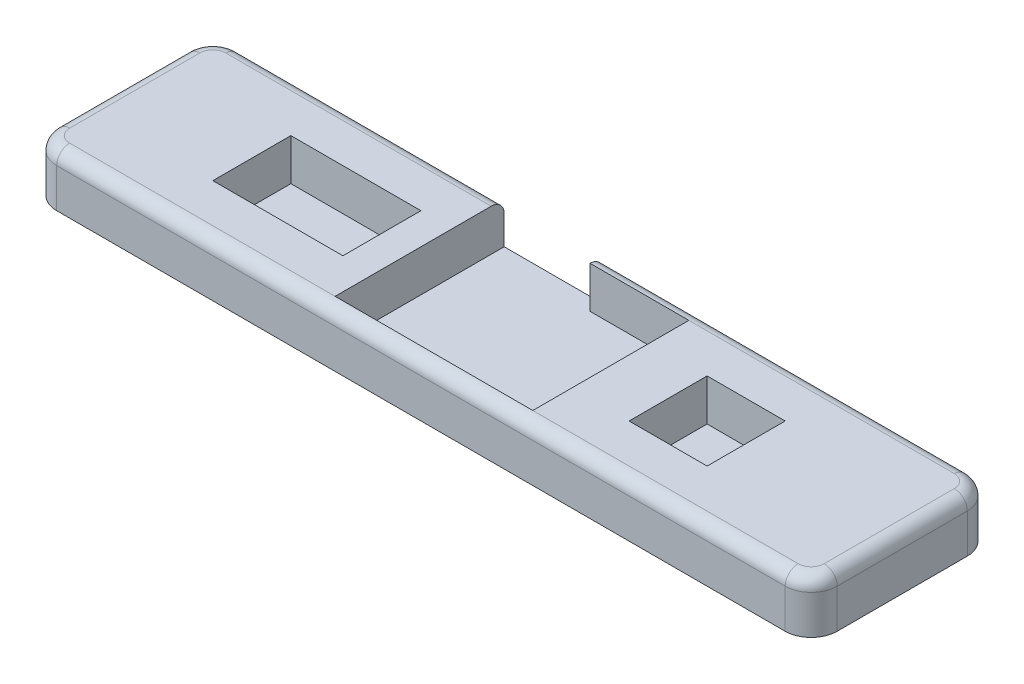
ISO-10303-21;
HEADER;
FILE_DESCRIPTION(('STEP AP214'),'2;1');
FILE_NAME('part.step','',(''),(''),'','','');
FILE_SCHEMA(('AUTOMOTIVE_DESIGN { 1 0 10303 214 1 1 1 1 }'));
ENDSEC;
DATA;
#1=APPLICATION_CONTEXT('core data for automotive mechanical design processes');
#2=APPLICATION_PROTOCOL_DEFINITION('international standard','automotive_design',2000,#1);
#3=PRODUCT_CONTEXT('',#1,'mechanical');
#4=PRODUCT('Part','Part','',(#3));
#5=PRODUCT_RELATED_PRODUCT_CATEGORY('part','',(#4));
#6=PRODUCT_DEFINITION_FORMATION('','',#4);
#7=PRODUCT_DEFINITION_CONTEXT('part definition',#1,'design');
#8=PRODUCT_DEFINITION('design','',#6,#7);
#9=PRODUCT_DEFINITION_SHAPE('','',#8);
#10=(LENGTH_UNIT() NAMED_UNIT(*) SI_UNIT(.MILLI.,.METRE.));
#11=(NAMED_UNIT(*) PLANE_ANGLE_UNIT() SI_UNIT($,.RADIAN.));
#12=(NAMED_UNIT(*) SI_UNIT($,.STERADIAN.) SOLID_ANGLE_UNIT());
#13=UNCERTAINTY_MEASURE_WITH_UNIT(LENGTH_MEASURE(1.E-05),#10,'distance_accuracy_value','');
#14=(GEOMETRIC_REPRESENTATION_CONTEXT(3) GLOBAL_UNCERTAINTY_ASSIGNED_CONTEXT((#13)) GLOBAL_UNIT_ASSIGNED_CONTEXT((#10,
#11,#12)) REPRESENTATION_CONTEXT('',''));
#15=CARTESIAN_POINT('',(0.,0.,0.));
#16=DIRECTION('',(0.,0.,1.));
#17=DIRECTION('',(1.,0.,0.));
#18=AXIS2_PLACEMENT_3D('',#15,#16,#17);
#19=CARTESIAN_POINT('',(0.,10.,0.));
#20=DIRECTION('',(0.,-1.,0.));
#21=DIRECTION('',(0.,0.,-1.));
#22=AXIS2_PLACEMENT_3D('',#19,#20,#21);
#23=PLANE('',#22);
#24=DIRECTION('',(0.,0.,-1.));
#25=VECTOR('',#24,1.);
#26=CARTESIAN_POINT('',(45.,10.,7.5));
#27=LINE('',#26,#25);
#28=CARTESIAN_POINT('',(45.,10.,7.5));
#29=VERTEX_POINT('',#28);
#30=CARTESIAN_POINT('',(45.,10.,-7.5));
#31=VERTEX_POINT('',#30);
#32=EDGE_CURVE('E457',#29,#31,#27,.T.);
#33=ORIENTED_EDGE('',*,*,#32,.F.);
#34=DIRECTION('',(1.,0.,0.));
#35=VECTOR('',#34,1.);
#36=CARTESIAN_POINT('',(30.,10.,7.5));
#37=LINE('',#36,#35);
#38=CARTESIAN_POINT('',(30.,10.,7.5));
#39=VERTEX_POINT('',#38);
#40=EDGE_CURVE('E450',#39,#29,#37,.T.);
#41=ORIENTED_EDGE('',*,*,#40,.F.);
#42=DIRECTION('',(0.,0.,1.));
#43=VECTOR('',#42,1.);
#44=CARTESIAN_POINT('',(30.,10.,7.5));
#45=LINE('',#44,#43);
#46=CARTESIAN_POINT('',(30.,10.,-7.5));
#47=VERTEX_POINT('',#46);
#48=EDGE_CURVE('E452',#47,#39,#45,.T.);
#49=ORIENTED_EDGE('',*,*,#48,.F.);
#50=DIRECTION('',(-1.,0.,0.));
#51=VECTOR('',#50,1.);
#52=CARTESIAN_POINT('',(30.,10.,-7.5));
#53=LINE('',#52,#51);
#54=EDGE_CURVE('E455',#31,#47,#53,.T.);
#55=ORIENTED_EDGE('',*,*,#54,.F.);
#56=EDGE_LOOP('',(#33,#41,#49,#55));
#57=FACE_BOUND('',#56,.T.);
#58=CARTESIAN_POINT('',(70.,10.,12.5));
#59=DIRECTION('',(0.,-1.,0.));
#60=DIRECTION('',(0.,0.,-1.));
#61=AXIS2_PLACEMENT_3D('',#58,#59,#60);
#62=CIRCLE('',#61,2.5);
#63=CARTESIAN_POINT('',(72.5,10.,12.5));
#64=VERTEX_POINT('',#63);
#65=CARTESIAN_POINT('',(70.,10.,15.));
#66=VERTEX_POINT('',#65);
#67=EDGE_CURVE('E269',#64,#66,#62,.T.);
#68=ORIENTED_EDGE('',*,*,#67,.F.);
#69=DIRECTION('',(0.,0.,-1.));
#70=VECTOR('',#69,1.);
#71=CARTESIAN_POINT('',(72.5,10.,0.));
#72=LINE('',#71,#70);
#73=CARTESIAN_POINT('',(72.5,10.,-12.5));
#74=VERTEX_POINT('',#73);
#75=EDGE_CURVE('E342',#64,#74,#72,.T.);
#76=ORIENTED_EDGE('',*,*,#75,.T.);
#77=CARTESIAN_POINT('',(70.,10.,-12.5));
#78=DIRECTION('',(0.,-1.,0.));
#79=DIRECTION('',(0.,0.,-1.));
#80=AXIS2_PLACEMENT_3D('',#77,#78,#79);
#81=CIRCLE('',#80,2.5);
#82=CARTESIAN_POINT('',(70.,10.,-15.));
#83=VERTEX_POINT('',#82);
#84=EDGE_CURVE('E266',#83,#74,#81,.T.);
#85=ORIENTED_EDGE('',*,*,#84,.F.);
#86=DIRECTION('',(-1.,0.,0.));
#87=VECTOR('',#86,1.);
#88=CARTESIAN_POINT('',(0.,10.,-15.));
#89=LINE('',#88,#87);
#90=CARTESIAN_POINT('',(19.,10.,-15.));
#91=VERTEX_POINT('',#90);
#92=EDGE_CURVE('E345',#83,#91,#89,.T.);
#93=ORIENTED_EDGE('',*,*,#92,.T.);
#94=DIRECTION('',(0.,0.,-1.));
#95=VECTOR('',#94,1.);
#96=CARTESIAN_POINT('',(19.,10.,15.));
#97=LINE('',#96,#95);
#98=CARTESIAN_POINT('',(19.,10.,15.));
#99=VERTEX_POINT('',#98);
#100=EDGE_CURVE('E238',#99,#91,#97,.T.);
#101=ORIENTED_EDGE('',*,*,#100,.F.);
#102=DIRECTION('',(1.,0.,0.));
#103=VECTOR('',#102,1.);
#104=CARTESIAN_POINT('',(0.,10.,15.));
#105=LINE('',#104,#103);
#106=EDGE_CURVE('E347',#99,#66,#105,.T.);
#107=ORIENTED_EDGE('',*,*,#106,.T.);
#108=EDGE_LOOP('',(#68,#76,#85,#93,#101,#107));
#109=FACE_BOUND('',#108,.T.);
#110=ADVANCED_FACE('F39',(#57,#109),#23,.F.);
#111=DIRECTION('',(0.,0.,-1.));
#112=VECTOR('',#111,1.);
#113=CARTESIAN_POINT('',(-25.,10.,7.5));
#114=LINE('',#113,#112);
#115=CARTESIAN_POINT('',(-25.,10.,7.5));
#116=VERTEX_POINT('',#115);
#117=CARTESIAN_POINT('',(-25.,10.,-7.5));
#118=VERTEX_POINT('',#117);
#119=EDGE_CURVE('E436',#116,#118,#114,.T.);
#120=ORIENTED_EDGE('',*,*,#119,.F.);
#121=DIRECTION('',(1.,0.,0.));
#122=VECTOR('',#121,1.);
#123=CARTESIAN_POINT('',(-50.,10.,7.5));
#124=LINE('',#123,#122);
#125=CARTESIAN_POINT('',(-50.,10.,7.5));
#126=VERTEX_POINT('',#125);
#127=EDGE_CURVE('E429',#126,#116,#124,.T.);
#128=ORIENTED_EDGE('',*,*,#127,.F.);
#129=DIRECTION('',(0.,0.,1.));
#130=VECTOR('',#129,1.);
#131=CARTESIAN_POINT('',(-50.,10.,7.5));
#132=LINE('',#131,#130);
#133=CARTESIAN_POINT('',(-50.,10.,-7.5));
#134=VERTEX_POINT('',#133);
#135=EDGE_CURVE('E431',#134,#126,#132,.T.);
#136=ORIENTED_EDGE('',*,*,#135,.F.);
#137=DIRECTION('',(-1.,0.,0.));
#138=VECTOR('',#137,1.);
#139=CARTESIAN_POINT('',(-50.,10.,-7.5));
#140=LINE('',#139,#138);
#141=EDGE_CURVE('E434',#118,#134,#140,.T.);
#142=ORIENTED_EDGE('',*,*,#141,.F.);
#143=EDGE_LOOP('',(#120,#128,#136,#142));
#144=FACE_BOUND('',#143,.T.);
#145=CARTESIAN_POINT('',(-70.,10.,12.5));
#146=DIRECTION('',(0.,-1.,0.));
#147=DIRECTION('',(0.,0.,-1.));
#148=AXIS2_PLACEMENT_3D('',#145,#146,#147);
#149=CIRCLE('',#148,2.5);
#150=CARTESIAN_POINT('',(-70.,10.,15.));
#151=VERTEX_POINT('',#150);
#152=CARTESIAN_POINT('',(-72.5,10.,12.5));
#153=VERTEX_POINT('',#152);
#154=EDGE_CURVE('E256',#151,#153,#149,.T.);
#155=ORIENTED_EDGE('',*,*,#154,.F.);
#156=DIRECTION('',(1.,0.,0.));
#157=VECTOR('',#156,1.);
#158=CARTESIAN_POINT('',(0.,10.,15.));
#159=LINE('',#158,#157);
#160=CARTESIAN_POINT('',(-19.,10.,15.));
#161=VERTEX_POINT('',#160);
#162=EDGE_CURVE('E350',#151,#161,#159,.T.);
#163=ORIENTED_EDGE('',*,*,#162,.T.);
#164=DIRECTION('',(0.,0.,1.));
#165=VECTOR('',#164,1.);
#166=CARTESIAN_POINT('',(-19.,10.,15.));
#167=LINE('',#166,#165);
#168=CARTESIAN_POINT('',(-19.,10.,-15.));
#169=VERTEX_POINT('',#168);
#170=EDGE_CURVE('E237',#169,#161,#167,.T.);
#171=ORIENTED_EDGE('',*,*,#170,.F.);
#172=DIRECTION('',(-1.,0.,0.));
#173=VECTOR('',#172,1.);
#174=CARTESIAN_POINT('',(0.,10.,-15.));
#175=LINE('',#174,#173);
#176=CARTESIAN_POINT('',(-70.,10.,-15.));
#177=VERTEX_POINT('',#176);
#178=EDGE_CURVE('E355',#169,#177,#175,.T.);
#179=ORIENTED_EDGE('',*,*,#178,.T.);
#180=CARTESIAN_POINT('',(-70.,10.,-12.5));
#181=DIRECTION('',(0.,-1.,0.));
#182=DIRECTION('',(0.,0.,-1.));
#183=AXIS2_PLACEMENT_3D('',#180,#181,#182);
#184=CIRCLE('',#183,2.5);
#185=CARTESIAN_POINT('',(-72.5,10.,-12.5));
#186=VERTEX_POINT('',#185);
#187=EDGE_CURVE('E248',#186,#177,#184,.T.);
#188=ORIENTED_EDGE('',*,*,#187,.F.);
#189=DIRECTION('',(0.,0.,1.));
#190=VECTOR('',#189,1.);
#191=CARTESIAN_POINT('',(-72.5,10.,0.));
#192=LINE('',#191,#190);
#193=EDGE_CURVE('E352',#186,#153,#192,.T.);
#194=ORIENTED_EDGE('',*,*,#193,.T.);
#195=EDGE_LOOP('',(#155,#163,#171,#179,#188,#194));
#196=FACE_BOUND('',#195,.T.);
#197=ADVANCED_FACE('F376',(#144,#196),#23,.F.);
#198=CARTESIAN_POINT('',(-19.,10.,-15.));
#199=DIRECTION('',(0.,0.,1.));
#200=DIRECTION('',(1.,0.,0.));
#201=AXIS2_PLACEMENT_3D('',#198,#199,#200);
#202=PLANE('',#201);
#203=DIRECTION('',(-1.,0.,0.));
#204=VECTOR('',#203,1.);
#205=CARTESIAN_POINT('',(-19.,10.,-15.));
#206=LINE('',#205,#204);
#207=CARTESIAN_POINT('',(0.,10.,-15.));
#208=VERTEX_POINT('',#207);
#209=EDGE_CURVE('E231',#91,#208,#206,.T.);
#210=ORIENTED_EDGE('',*,*,#209,.T.);
#211=DIRECTION('',(0.,-1.,0.));
#212=VECTOR('',#211,1.);
#213=CARTESIAN_POINT('',(0.,10.,-15.));
#214=LINE('',#213,#212);
#215=CARTESIAN_POINT('',(0.,2.,-15.));
#216=VERTEX_POINT('',#215);
#217=EDGE_CURVE('E216',#208,#216,#214,.T.);
#218=ORIENTED_EDGE('',*,*,#217,.T.);
#219=DIRECTION('',(1.,0.,0.));
#220=VECTOR('',#219,1.);
#221=CARTESIAN_POINT('',(-19.,2.,-15.));
#222=LINE('',#221,#220);
#223=CARTESIAN_POINT('',(19.,2.,-15.));
#224=VERTEX_POINT('',#223);
#225=EDGE_CURVE('E473',#216,#224,#222,.T.);
#226=ORIENTED_EDGE('',*,*,#225,.T.);
#227=DIRECTION('',(0.,-1.,0.));
#228=VECTOR('',#227,1.);
#229=CARTESIAN_POINT('',(19.,10.,-15.));
#230=LINE('',#229,#228);
#231=EDGE_CURVE('E234',#91,#224,#230,.T.);
#232=ORIENTED_EDGE('',*,*,#231,.F.);
#233=EDGE_LOOP('',(#210,#218,#226,#232));
#234=FACE_BOUND('',#233,.T.);
#235=ADVANCED_FACE('F232',(#234),#202,.T.);
#236=CARTESIAN_POINT('',(-75.,10.,-17.5));
#237=DIRECTION('',(0.,0.,1.));
#238=DIRECTION('',(1.,0.,0.));
#239=AXIS2_PLACEMENT_3D('',#236,#237,#238);
#240=PLANE('',#239);
#241=DIRECTION('',(-1.,0.,0.));
#242=VECTOR('',#241,1.);
#243=CARTESIAN_POINT('',(-75.,7.5,-17.5));
#244=LINE('',#243,#242);
#245=CARTESIAN_POINT('',(0.,7.5,-17.5));
#246=VERTEX_POINT('',#245);
#247=CARTESIAN_POINT('',(70.,7.5,-17.5));
#248=VERTEX_POINT('',#247);
#249=EDGE_CURVE('E243',#246,#248,#244,.F.);
#250=ORIENTED_EDGE('',*,*,#249,.T.);
#251=DIRECTION('',(0.,-1.,0.));
#252=VECTOR('',#251,1.);
#253=CARTESIAN_POINT('',(70.,10.,-17.5));
#254=LINE('',#253,#252);
#255=CARTESIAN_POINT('',(70.,0.,-17.5));
#256=VERTEX_POINT('',#255);
#257=EDGE_CURVE('E284',#248,#256,#254,.T.);
#258=ORIENTED_EDGE('',*,*,#257,.T.);
#259=DIRECTION('',(-1.,0.,0.));
#260=VECTOR('',#259,1.);
#261=CARTESIAN_POINT('',(-75.,0.,-17.5));
#262=LINE('',#261,#260);
#263=CARTESIAN_POINT('',(-70.,0.,-17.5));
#264=VERTEX_POINT('',#263);
#265=EDGE_CURVE('E326',#256,#264,#262,.T.);
#266=ORIENTED_EDGE('',*,*,#265,.T.);
#267=DIRECTION('',(0.,-1.,0.));
#268=VECTOR('',#267,1.);
#269=CARTESIAN_POINT('',(-70.,10.,-17.5));
#270=LINE('',#269,#268);
#271=CARTESIAN_POINT('',(-70.,7.5,-17.5));
#272=VERTEX_POINT('',#271);
#273=EDGE_CURVE('E282',#264,#272,#270,.F.);
#274=ORIENTED_EDGE('',*,*,#273,.T.);
#275=DIRECTION('',(-1.,0.,0.));
#276=VECTOR('',#275,1.);
#277=CARTESIAN_POINT('',(-75.,7.5,-17.5));
#278=LINE('',#277,#276);
#279=CARTESIAN_POINT('',(-19.,7.5,-17.5));
#280=VERTEX_POINT('',#279);
#281=EDGE_CURVE('E361',#272,#280,#278,.F.);
#282=ORIENTED_EDGE('',*,*,#281,.T.);
#283=DIRECTION('',(0.,-1.,0.));
#284=VECTOR('',#283,1.);
#285=CARTESIAN_POINT('',(-19.,10.,-17.5));
#286=LINE('',#285,#284);
#287=CARTESIAN_POINT('',(-19.,2.,-17.5));
#288=VERTEX_POINT('',#287);
#289=EDGE_CURVE('E226',#280,#288,#286,.T.);
#290=ORIENTED_EDGE('',*,*,#289,.T.);
#291=DIRECTION('',(-1.,0.,0.));
#292=VECTOR('',#291,1.);
#293=CARTESIAN_POINT('',(0.,2.,-17.5));
#294=LINE('',#293,#292);
#295=CARTESIAN_POINT('',(0.,2.,-17.5));
#296=VERTEX_POINT('',#295);
#297=EDGE_CURVE('E227',#296,#288,#294,.T.);
#298=ORIENTED_EDGE('',*,*,#297,.F.);
#299=DIRECTION('',(0.,-1.,0.));
#300=VECTOR('',#299,1.);
#301=CARTESIAN_POINT('',(0.,10.,-17.5));
#302=LINE('',#301,#300);
#303=EDGE_CURVE('E491',#246,#296,#302,.T.);
#304=ORIENTED_EDGE('',*,*,#303,.F.);
#305=EDGE_LOOP('',(#250,#258,#266,#274,#282,#290,#298,#304));
#306=FACE_BOUND('',#305,.T.);
#307=ADVANCED_FACE('F325',(#306),#240,.F.);
#308=CARTESIAN_POINT('',(45.,10.,7.5));
#309=DIRECTION('',(-1.,0.,0.));
#310=DIRECTION('',(0.,0.,1.));
#311=AXIS2_PLACEMENT_3D('',#308,#309,#310);
#312=PLANE('',#311);
#313=DIRECTION('',(0.,-1.,0.));
#314=VECTOR('',#313,1.);
#315=CARTESIAN_POINT('',(45.,10.,-7.5));
#316=LINE('',#315,#314);
#317=CARTESIAN_POINT('',(45.,2.,-7.5));
#318=VERTEX_POINT('',#317);
#319=EDGE_CURVE('E438',#31,#318,#316,.T.);
#320=ORIENTED_EDGE('',*,*,#319,.T.);
#321=DIRECTION('',(0.,0.,1.));
#322=VECTOR('',#321,1.);
#323=CARTESIAN_POINT('',(45.,2.,7.5));
#324=LINE('',#323,#322);
#325=CARTESIAN_POINT('',(45.,2.,7.5));
#326=VERTEX_POINT('',#325);
#327=EDGE_CURVE('E485',#318,#326,#324,.T.);
#328=ORIENTED_EDGE('',*,*,#327,.T.);
#329=DIRECTION('',(0.,-1.,0.));
#330=VECTOR('',#329,1.);
#331=CARTESIAN_POINT('',(45.,10.,7.5));
#332=LINE('',#331,#330);
#333=EDGE_CURVE('E447',#29,#326,#332,.T.);
#334=ORIENTED_EDGE('',*,*,#333,.F.);
#335=ORIENTED_EDGE('',*,*,#32,.T.);
#336=EDGE_LOOP('',(#320,#328,#334,#335));
#337=FACE_BOUND('',#336,.T.);
#338=ADVANCED_FACE('F537',(#337),#312,.T.);
#339=CARTESIAN_POINT('',(30.,10.,-7.5));
#340=DIRECTION('',(0.,0.,1.));
#341=DIRECTION('',(1.,0.,0.));
#342=AXIS2_PLACEMENT_3D('',#339,#340,#341);
#343=PLANE('',#342);
#344=DIRECTION('',(0.,-1.,0.));
#345=VECTOR('',#344,1.);
#346=CARTESIAN_POINT('',(30.,10.,-7.5));
#347=LINE('',#346,#345);
#348=CARTESIAN_POINT('',(30.,2.,-7.5));
#349=VERTEX_POINT('',#348);
#350=EDGE_CURVE('E441',#47,#349,#347,.T.);
#351=ORIENTED_EDGE('',*,*,#350,.T.);
#352=DIRECTION('',(1.,0.,0.));
#353=VECTOR('',#352,1.);
#354=CARTESIAN_POINT('',(30.,2.,-7.5));
#355=LINE('',#354,#353);
#356=EDGE_CURVE('E482',#349,#318,#355,.T.);
#357=ORIENTED_EDGE('',*,*,#356,.T.);
#358=ORIENTED_EDGE('',*,*,#319,.F.);
#359=ORIENTED_EDGE('',*,*,#54,.T.);
#360=EDGE_LOOP('',(#351,#357,#358,#359));
#361=FACE_BOUND('',#360,.T.);
#362=ADVANCED_FACE('F754',(#361),#343,.T.);
#363=CARTESIAN_POINT('',(30.,10.,7.5));
#364=DIRECTION('',(1.,0.,0.));
#365=DIRECTION('',(0.,0.,-1.));
#366=AXIS2_PLACEMENT_3D('',#363,#364,#365);
#367=PLANE('',#366);
#368=DIRECTION('',(0.,-1.,0.));
#369=VECTOR('',#368,1.);
#370=CARTESIAN_POINT('',(30.,10.,7.5));
#371=LINE('',#370,#369);
#372=CARTESIAN_POINT('',(30.,2.,7.5));
#373=VERTEX_POINT('',#372);
#374=EDGE_CURVE('E444',#39,#373,#371,.T.);
#375=ORIENTED_EDGE('',*,*,#374,.T.);
#376=DIRECTION('',(0.,0.,-1.));
#377=VECTOR('',#376,1.);
#378=CARTESIAN_POINT('',(30.,2.,7.5));
#379=LINE('',#378,#377);
#380=EDGE_CURVE('E479',#373,#349,#379,.T.);
#381=ORIENTED_EDGE('',*,*,#380,.T.);
#382=ORIENTED_EDGE('',*,*,#350,.F.);
#383=ORIENTED_EDGE('',*,*,#48,.T.);
#384=EDGE_LOOP('',(#375,#381,#382,#383));
#385=FACE_BOUND('',#384,.T.);
#386=ADVANCED_FACE('F742',(#385),#367,.T.);
#387=CARTESIAN_POINT('',(30.,10.,7.5));
#388=DIRECTION('',(0.,0.,-1.));
#389=DIRECTION('',(-1.,0.,0.));
#390=AXIS2_PLACEMENT_3D('',#387,#388,#389);
#391=PLANE('',#390);
#392=ORIENTED_EDGE('',*,*,#333,.T.);
#393=DIRECTION('',(-1.,0.,0.));
#394=VECTOR('',#393,1.);
#395=CARTESIAN_POINT('',(30.,2.,7.5));
#396=LINE('',#395,#394);
#397=EDGE_CURVE('E488',#326,#373,#396,.T.);
#398=ORIENTED_EDGE('',*,*,#397,.T.);
#399=ORIENTED_EDGE('',*,*,#374,.F.);
#400=ORIENTED_EDGE('',*,*,#40,.T.);
#401=EDGE_LOOP('',(#392,#398,#399,#400));
#402=FACE_BOUND('',#401,.T.);
#403=ADVANCED_FACE('F737',(#402),#391,.T.);
#404=CARTESIAN_POINT('',(19.,10.,15.));
#405=DIRECTION('',(-1.,0.,0.));
#406=DIRECTION('',(0.,0.,1.));
#407=AXIS2_PLACEMENT_3D('',#404,#405,#406);
#408=PLANE('',#407);
#409=ORIENTED_EDGE('',*,*,#231,.T.);
#410=DIRECTION('',(0.,0.,1.));
#411=VECTOR('',#410,1.);
#412=CARTESIAN_POINT('',(19.,2.,15.));
#413=LINE('',#412,#411);
#414=CARTESIAN_POINT('',(19.,2.,15.));
#415=VERTEX_POINT('',#414);
#416=EDGE_CURVE('E412',#224,#415,#413,.T.);
#417=ORIENTED_EDGE('',*,*,#416,.T.);
#418=DIRECTION('',(0.,-1.,0.));
#419=VECTOR('',#418,1.);
#420=CARTESIAN_POINT('',(19.,10.,15.));
#421=LINE('',#420,#419);
#422=EDGE_CURVE('E402',#99,#415,#421,.T.);
#423=ORIENTED_EDGE('',*,*,#422,.F.);
#424=ORIENTED_EDGE('',*,*,#100,.T.);
#425=EDGE_LOOP('',(#409,#417,#423,#424));
#426=FACE_BOUND('',#425,.T.);
#427=ADVANCED_FACE('F410',(#426),#408,.T.);
#428=CARTESIAN_POINT('',(-19.,10.,15.));
#429=DIRECTION('',(1.,0.,0.));
#430=DIRECTION('',(0.,0.,-1.));
#431=AXIS2_PLACEMENT_3D('',#428,#429,#430);
#432=PLANE('',#431);
#433=ORIENTED_EDGE('',*,*,#289,.F.);
#434=CARTESIAN_POINT('',(-19.,7.5,-15.));
#435=DIRECTION('',(1.,0.,0.));
#436=DIRECTION('',(0.,0.,-1.));
#437=AXIS2_PLACEMENT_3D('',#434,#435,#436);
#438=CIRCLE('',#437,2.5);
#439=EDGE_CURVE('E251',#280,#169,#438,.T.);
#440=ORIENTED_EDGE('',*,*,#439,.T.);
#441=ORIENTED_EDGE('',*,*,#170,.T.);
#442=DIRECTION('',(0.,-1.,0.));
#443=VECTOR('',#442,1.);
#444=CARTESIAN_POINT('',(-19.,10.,15.));
#445=LINE('',#444,#443);
#446=CARTESIAN_POINT('',(-19.,2.,15.));
#447=VERTEX_POINT('',#446);
#448=EDGE_CURVE('E404',#161,#447,#445,.T.);
#449=ORIENTED_EDGE('',*,*,#448,.T.);
#450=DIRECTION('',(0.,0.,-1.));
#451=VECTOR('',#450,1.);
#452=CARTESIAN_POINT('',(-19.,2.,15.));
#453=LINE('',#452,#451);
#454=EDGE_CURVE('E471',#447,#288,#453,.T.);
#455=ORIENTED_EDGE('',*,*,#454,.T.);
#456=EDGE_LOOP('',(#433,#440,#441,#449,#455));
#457=FACE_BOUND('',#456,.T.);
#458=ADVANCED_FACE('F367',(#457),#432,.T.);
#459=CARTESIAN_POINT('',(-19.,10.,15.));
#460=DIRECTION('',(0.,0.,-1.));
#461=DIRECTION('',(-1.,0.,0.));
#462=AXIS2_PLACEMENT_3D('',#459,#460,#461);
#463=PLANE('',#462);
#464=ORIENTED_EDGE('',*,*,#422,.T.);
#465=DIRECTION('',(-1.,0.,0.));
#466=VECTOR('',#465,1.);
#467=CARTESIAN_POINT('',(-19.,2.,15.));
#468=LINE('',#467,#466);
#469=EDGE_CURVE('E476',#415,#447,#468,.T.);
#470=ORIENTED_EDGE('',*,*,#469,.T.);
#471=ORIENTED_EDGE('',*,*,#448,.F.);
#472=DIRECTION('',(1.,0.,0.));
#473=VECTOR('',#472,1.);
#474=CARTESIAN_POINT('',(-19.,10.,15.));
#475=LINE('',#474,#473);
#476=EDGE_CURVE('E378',#161,#99,#475,.T.);
#477=ORIENTED_EDGE('',*,*,#476,.T.);
#478=EDGE_LOOP('',(#464,#470,#471,#477));
#479=FACE_BOUND('',#478,.T.);
#480=ADVANCED_FACE('F499',(#479),#463,.T.);
#481=CARTESIAN_POINT('',(-25.,10.,7.5));
#482=DIRECTION('',(-1.,0.,0.));
#483=DIRECTION('',(0.,0.,1.));
#484=AXIS2_PLACEMENT_3D('',#481,#482,#483);
#485=PLANE('',#484);
#486=DIRECTION('',(0.,-1.,0.));
#487=VECTOR('',#486,1.);
#488=CARTESIAN_POINT('',(-25.,10.,-7.5));
#489=LINE('',#488,#487);
#490=CARTESIAN_POINT('',(-25.,2.,-7.5));
#491=VERTEX_POINT('',#490);
#492=EDGE_CURVE('E415',#118,#491,#489,.T.);
#493=ORIENTED_EDGE('',*,*,#492,.T.);
#494=DIRECTION('',(0.,0.,1.));
#495=VECTOR('',#494,1.);
#496=CARTESIAN_POINT('',(-25.,2.,7.5));
#497=LINE('',#496,#495);
#498=CARTESIAN_POINT('',(-25.,2.,7.5));
#499=VERTEX_POINT('',#498);
#500=EDGE_CURVE('E462',#491,#499,#497,.T.);
#501=ORIENTED_EDGE('',*,*,#500,.T.);
#502=DIRECTION('',(0.,-1.,0.));
#503=VECTOR('',#502,1.);
#504=CARTESIAN_POINT('',(-25.,10.,7.5));
#505=LINE('',#504,#503);
#506=EDGE_CURVE('E426',#116,#499,#505,.T.);
#507=ORIENTED_EDGE('',*,*,#506,.F.);
#508=ORIENTED_EDGE('',*,*,#119,.T.);
#509=EDGE_LOOP('',(#493,#501,#507,#508));
#510=FACE_BOUND('',#509,.T.);
#511=ADVANCED_FACE('F501',(#510),#485,.T.);
#512=CARTESIAN_POINT('',(-50.,10.,-7.5));
#513=DIRECTION('',(0.,0.,1.));
#514=DIRECTION('',(1.,0.,0.));
#515=AXIS2_PLACEMENT_3D('',#512,#513,#514);
#516=PLANE('',#515);
#517=DIRECTION('',(0.,-1.,0.));
#518=VECTOR('',#517,1.);
#519=CARTESIAN_POINT('',(-50.,10.,-7.5));
#520=LINE('',#519,#518);
#521=CARTESIAN_POINT('',(-50.,2.,-7.5));
#522=VERTEX_POINT('',#521);
#523=EDGE_CURVE('E418',#134,#522,#520,.T.);
#524=ORIENTED_EDGE('',*,*,#523,.T.);
#525=DIRECTION('',(1.,0.,0.));
#526=VECTOR('',#525,1.);
#527=CARTESIAN_POINT('',(-50.,2.,-7.5));
#528=LINE('',#527,#526);
#529=EDGE_CURVE('E465',#522,#491,#528,.T.);
#530=ORIENTED_EDGE('',*,*,#529,.T.);
#531=ORIENTED_EDGE('',*,*,#492,.F.);
#532=ORIENTED_EDGE('',*,*,#141,.T.);
#533=EDGE_LOOP('',(#524,#530,#531,#532));
#534=FACE_BOUND('',#533,.T.);
#535=ADVANCED_FACE('F507',(#534),#516,.T.);
#536=CARTESIAN_POINT('',(-50.,10.,7.5));
#537=DIRECTION('',(1.,0.,0.));
#538=DIRECTION('',(0.,0.,-1.));
#539=AXIS2_PLACEMENT_3D('',#536,#537,#538);
#540=PLANE('',#539);
#541=DIRECTION('',(0.,-1.,0.));
#542=VECTOR('',#541,1.);
#543=CARTESIAN_POINT('',(-50.,10.,7.5));
#544=LINE('',#543,#542);
#545=CARTESIAN_POINT('',(-50.,2.,7.5));
#546=VERTEX_POINT('',#545);
#547=EDGE_CURVE('E423',#126,#546,#544,.T.);
#548=ORIENTED_EDGE('',*,*,#547,.T.);
#549=DIRECTION('',(0.,0.,-1.));
#550=VECTOR('',#549,1.);
#551=CARTESIAN_POINT('',(-50.,2.,7.5));
#552=LINE('',#551,#550);
#553=EDGE_CURVE('E468',#546,#522,#552,.T.);
#554=ORIENTED_EDGE('',*,*,#553,.T.);
#555=ORIENTED_EDGE('',*,*,#523,.F.);
#556=ORIENTED_EDGE('',*,*,#135,.T.);
#557=EDGE_LOOP('',(#548,#554,#555,#556));
#558=FACE_BOUND('',#557,.T.);
#559=ADVANCED_FACE('F711',(#558),#540,.T.);
#560=CARTESIAN_POINT('',(-50.,10.,7.5));
#561=DIRECTION('',(0.,0.,-1.));
#562=DIRECTION('',(-1.,0.,0.));
#563=AXIS2_PLACEMENT_3D('',#560,#561,#562);
#564=PLANE('',#563);
#565=ORIENTED_EDGE('',*,*,#506,.T.);
#566=DIRECTION('',(-1.,0.,0.));
#567=VECTOR('',#566,1.);
#568=CARTESIAN_POINT('',(-50.,2.,7.5));
#569=LINE('',#568,#567);
#570=EDGE_CURVE('E459',#499,#546,#569,.T.);
#571=ORIENTED_EDGE('',*,*,#570,.T.);
#572=ORIENTED_EDGE('',*,*,#547,.F.);
#573=ORIENTED_EDGE('',*,*,#127,.T.);
#574=EDGE_LOOP('',(#565,#571,#572,#573));
#575=FACE_BOUND('',#574,.T.);
#576=ADVANCED_FACE('F526',(#575),#564,.T.);
#577=CARTESIAN_POINT('',(0.,0.,0.));
#578=DIRECTION('',(0.,-1.,0.));
#579=DIRECTION('',(0.,0.,-1.));
#580=AXIS2_PLACEMENT_3D('',#577,#578,#579);
#581=PLANE('',#580);
#582=ORIENTED_EDGE('',*,*,#265,.F.);
#583=CARTESIAN_POINT('',(70.,0.,-12.5));
#584=DIRECTION('',(0.,-1.,0.));
#585=DIRECTION('',(0.,0.,-1.));
#586=AXIS2_PLACEMENT_3D('',#583,#584,#585);
#587=CIRCLE('',#586,5.);
#588=CARTESIAN_POINT('',(75.,0.,-12.5));
#589=VERTEX_POINT('',#588);
#590=EDGE_CURVE('E291',#256,#589,#587,.T.);
#591=ORIENTED_EDGE('',*,*,#590,.T.);
#592=DIRECTION('',(0.,0.,-1.));
#593=VECTOR('',#592,1.);
#594=CARTESIAN_POINT('',(75.,0.,17.5));
#595=LINE('',#594,#593);
#596=CARTESIAN_POINT('',(75.,0.,12.5));
#597=VERTEX_POINT('',#596);
#598=EDGE_CURVE('E333',#597,#589,#595,.T.);
#599=ORIENTED_EDGE('',*,*,#598,.F.);
#600=CARTESIAN_POINT('',(70.,0.,12.5));
#601=DIRECTION('',(0.,-1.,0.));
#602=DIRECTION('',(0.,0.,-1.));
#603=AXIS2_PLACEMENT_3D('',#600,#601,#602);
#604=CIRCLE('',#603,5.);
#605=CARTESIAN_POINT('',(70.,0.,17.5));
#606=VERTEX_POINT('',#605);
#607=EDGE_CURVE('E289',#597,#606,#604,.T.);
#608=ORIENTED_EDGE('',*,*,#607,.T.);
#609=DIRECTION('',(1.,0.,0.));
#610=VECTOR('',#609,1.);
#611=CARTESIAN_POINT('',(-75.,0.,17.5));
#612=LINE('',#611,#610);
#613=CARTESIAN_POINT('',(-70.,0.,17.5));
#614=VERTEX_POINT('',#613);
#615=EDGE_CURVE('E335',#614,#606,#612,.T.);
#616=ORIENTED_EDGE('',*,*,#615,.F.);
#617=CARTESIAN_POINT('',(-70.,0.,12.5));
#618=DIRECTION('',(0.,-1.,0.));
#619=DIRECTION('',(0.,0.,-1.));
#620=AXIS2_PLACEMENT_3D('',#617,#618,#619);
#621=CIRCLE('',#620,5.);
#622=CARTESIAN_POINT('',(-75.,0.,12.5));
#623=VERTEX_POINT('',#622);
#624=EDGE_CURVE('E56',#614,#623,#621,.T.);
#625=ORIENTED_EDGE('',*,*,#624,.T.);
#626=DIRECTION('',(0.,0.,1.));
#627=VECTOR('',#626,1.);
#628=CARTESIAN_POINT('',(-75.,0.,17.5));
#629=LINE('',#628,#627);
#630=CARTESIAN_POINT('',(-75.,0.,-12.5));
#631=VERTEX_POINT('',#630);
#632=EDGE_CURVE('E332',#631,#623,#629,.T.);
#633=ORIENTED_EDGE('',*,*,#632,.F.);
#634=CARTESIAN_POINT('',(-70.,0.,-12.5));
#635=DIRECTION('',(0.,-1.,0.));
#636=DIRECTION('',(0.,0.,-1.));
#637=AXIS2_PLACEMENT_3D('',#634,#635,#636);
#638=CIRCLE('',#637,5.);
#639=EDGE_CURVE('E287',#631,#264,#638,.T.);
#640=ORIENTED_EDGE('',*,*,#639,.T.);
#641=EDGE_LOOP('',(#582,#591,#599,#608,#616,#625,#633,#640));
#642=FACE_BOUND('',#641,.T.);
#643=ADVANCED_FACE('F328',(#642),#581,.T.);
#644=CARTESIAN_POINT('',(75.,10.,17.5));
#645=DIRECTION('',(-1.,0.,0.));
#646=DIRECTION('',(0.,0.,1.));
#647=AXIS2_PLACEMENT_3D('',#644,#645,#646);
#648=PLANE('',#647);
#649=ORIENTED_EDGE('',*,*,#598,.T.);
#650=DIRECTION('',(0.,-1.,0.));
#651=VECTOR('',#650,1.);
#652=CARTESIAN_POINT('',(75.,10.,-12.5));
#653=LINE('',#652,#651);
#654=CARTESIAN_POINT('',(75.,7.5,-12.5));
#655=VERTEX_POINT('',#654);
#656=EDGE_CURVE('E295',#589,#655,#653,.F.);
#657=ORIENTED_EDGE('',*,*,#656,.T.);
#658=DIRECTION('',(0.,0.,-1.));
#659=VECTOR('',#658,1.);
#660=CARTESIAN_POINT('',(75.,7.5,17.5));
#661=LINE('',#660,#659);
#662=CARTESIAN_POINT('',(75.,7.5,12.5));
#663=VERTEX_POINT('',#662);
#664=EDGE_CURVE('E244',#655,#663,#661,.F.);
#665=ORIENTED_EDGE('',*,*,#664,.T.);
#666=DIRECTION('',(0.,-1.,0.));
#667=VECTOR('',#666,1.);
#668=CARTESIAN_POINT('',(75.,10.,12.5));
#669=LINE('',#668,#667);
#670=EDGE_CURVE('E293',#663,#597,#669,.T.);
#671=ORIENTED_EDGE('',*,*,#670,.T.);
#672=EDGE_LOOP('',(#649,#657,#665,#671));
#673=FACE_BOUND('',#672,.T.);
#674=ADVANCED_FACE('F525',(#673),#648,.F.);
#675=CARTESIAN_POINT('',(-75.,10.,17.5));
#676=DIRECTION('',(1.,0.,0.));
#677=DIRECTION('',(0.,0.,-1.));
#678=AXIS2_PLACEMENT_3D('',#675,#676,#677);
#679=PLANE('',#678);
#680=DIRECTION('',(0.,0.,1.));
#681=VECTOR('',#680,1.);
#682=CARTESIAN_POINT('',(-75.,7.5,17.5));
#683=LINE('',#682,#681);
#684=CARTESIAN_POINT('',(-75.,7.5,12.5));
#685=VERTEX_POINT('',#684);
#686=CARTESIAN_POINT('',(-75.,7.5,-12.5));
#687=VERTEX_POINT('',#686);
#688=EDGE_CURVE('E358',#685,#687,#683,.F.);
#689=ORIENTED_EDGE('',*,*,#688,.T.);
#690=DIRECTION('',(0.,-1.,0.));
#691=VECTOR('',#690,1.);
#692=CARTESIAN_POINT('',(-75.,10.,-12.5));
#693=LINE('',#692,#691);
#694=EDGE_CURVE('E11',#687,#631,#693,.T.);
#695=ORIENTED_EDGE('',*,*,#694,.T.);
#696=ORIENTED_EDGE('',*,*,#632,.T.);
#697=DIRECTION('',(0.,-1.,0.));
#698=VECTOR('',#697,1.);
#699=CARTESIAN_POINT('',(-75.,10.,12.5));
#700=LINE('',#699,#698);
#701=EDGE_CURVE('E48',#623,#685,#700,.F.);
#702=ORIENTED_EDGE('',*,*,#701,.T.);
#703=EDGE_LOOP('',(#689,#695,#696,#702));
#704=FACE_BOUND('',#703,.T.);
#705=ADVANCED_FACE('F531',(#704),#679,.F.);
#706=CARTESIAN_POINT('',(-75.,10.,17.5));
#707=DIRECTION('',(0.,0.,-1.));
#708=DIRECTION('',(-1.,0.,0.));
#709=AXIS2_PLACEMENT_3D('',#706,#707,#708);
#710=PLANE('',#709);
#711=ORIENTED_EDGE('',*,*,#615,.T.);
#712=DIRECTION('',(0.,-1.,0.));
#713=VECTOR('',#712,1.);
#714=CARTESIAN_POINT('',(70.,10.,17.5));
#715=LINE('',#714,#713);
#716=CARTESIAN_POINT('',(70.,7.5,17.5));
#717=VERTEX_POINT('',#716);
#718=EDGE_CURVE('E299',#606,#717,#715,.F.);
#719=ORIENTED_EDGE('',*,*,#718,.T.);
#720=DIRECTION('',(1.,0.,0.));
#721=VECTOR('',#720,1.);
#722=CARTESIAN_POINT('',(-75.,7.5,17.5));
#723=LINE('',#722,#721);
#724=CARTESIAN_POINT('',(-70.,7.5,17.5));
#725=VERTEX_POINT('',#724);
#726=EDGE_CURVE('E245',#717,#725,#723,.F.);
#727=ORIENTED_EDGE('',*,*,#726,.T.);
#728=DIRECTION('',(0.,-1.,0.));
#729=VECTOR('',#728,1.);
#730=CARTESIAN_POINT('',(-70.,10.,17.5));
#731=LINE('',#730,#729);
#732=EDGE_CURVE('E297',#725,#614,#731,.T.);
#733=ORIENTED_EDGE('',*,*,#732,.T.);
#734=EDGE_LOOP('',(#711,#719,#727,#733));
#735=FACE_BOUND('',#734,.T.);
#736=ADVANCED_FACE('F527',(#735),#710,.F.);
#737=CARTESIAN_POINT('',(0.,2.,0.));
#738=DIRECTION('',(0.,-1.,0.));
#739=DIRECTION('',(0.,0.,-1.));
#740=AXIS2_PLACEMENT_3D('',#737,#738,#739);
#741=PLANE('',#740);
#742=ORIENTED_EDGE('',*,*,#553,.F.);
#743=ORIENTED_EDGE('',*,*,#570,.F.);
#744=ORIENTED_EDGE('',*,*,#500,.F.);
#745=ORIENTED_EDGE('',*,*,#529,.F.);
#746=EDGE_LOOP('',(#742,#743,#744,#745));
#747=FACE_BOUND('',#746,.T.);
#748=ADVANCED_FACE('F530',(#747),#741,.F.);
#749=CARTESIAN_POINT('',(0.,2.,0.));
#750=DIRECTION('',(0.,-1.,0.));
#751=DIRECTION('',(0.,0.,-1.));
#752=AXIS2_PLACEMENT_3D('',#749,#750,#751);
#753=PLANE('',#752);
#754=ORIENTED_EDGE('',*,*,#454,.F.);
#755=ORIENTED_EDGE('',*,*,#469,.F.);
#756=ORIENTED_EDGE('',*,*,#416,.F.);
#757=ORIENTED_EDGE('',*,*,#225,.F.);
#758=DIRECTION('',(0.,0.,-1.));
#759=VECTOR('',#758,1.);
#760=CARTESIAN_POINT('',(0.,2.,-15.));
#761=LINE('',#760,#759);
#762=EDGE_CURVE('E223',#216,#296,#761,.T.);
#763=ORIENTED_EDGE('',*,*,#762,.T.);
#764=ORIENTED_EDGE('',*,*,#297,.T.);
#765=EDGE_LOOP('',(#754,#755,#756,#757,#763,#764));
#766=FACE_BOUND('',#765,.T.);
#767=ADVANCED_FACE('F498',(#766),#753,.F.);
#768=CARTESIAN_POINT('',(0.,2.,0.));
#769=DIRECTION('',(0.,-1.,0.));
#770=DIRECTION('',(0.,0.,-1.));
#771=AXIS2_PLACEMENT_3D('',#768,#769,#770);
#772=PLANE('',#771);
#773=ORIENTED_EDGE('',*,*,#380,.F.);
#774=ORIENTED_EDGE('',*,*,#397,.F.);
#775=ORIENTED_EDGE('',*,*,#327,.F.);
#776=ORIENTED_EDGE('',*,*,#356,.F.);
#777=EDGE_LOOP('',(#773,#774,#775,#776));
#778=FACE_BOUND('',#777,.T.);
#779=ADVANCED_FACE('F654',(#778),#772,.F.);
#780=CARTESIAN_POINT('',(0.,10.,-15.));
#781=DIRECTION('',(-1.,0.,0.));
#782=DIRECTION('',(0.,0.,1.));
#783=AXIS2_PLACEMENT_3D('',#780,#781,#782);
#784=PLANE('',#783);
#785=ORIENTED_EDGE('',*,*,#217,.F.);
#786=CARTESIAN_POINT('',(0.,7.5,-15.));
#787=DIRECTION('',(-1.,0.,0.));
#788=DIRECTION('',(0.,0.,1.));
#789=AXIS2_PLACEMENT_3D('',#786,#787,#788);
#790=CIRCLE('',#789,2.5);
#791=EDGE_CURVE('E220',#208,#246,#790,.T.);
#792=ORIENTED_EDGE('',*,*,#791,.T.);
#793=ORIENTED_EDGE('',*,*,#303,.T.);
#794=ORIENTED_EDGE('',*,*,#762,.F.);
#795=EDGE_LOOP('',(#785,#792,#793,#794));
#796=FACE_BOUND('',#795,.T.);
#797=ADVANCED_FACE('F218',(#796),#784,.T.);
#798=CARTESIAN_POINT('',(0.,7.5,-15.));
#799=DIRECTION('',(-1.,0.,0.));
#800=DIRECTION('',(0.,0.,1.));
#801=AXIS2_PLACEMENT_3D('',#798,#799,#800);
#802=CYLINDRICAL_SURFACE('',#801,2.5);
#803=ORIENTED_EDGE('',*,*,#92,.F.);
#804=CARTESIAN_POINT('',(70.,7.5,-15.));
#805=DIRECTION('',(-1.,0.,0.));
#806=DIRECTION('',(0.,0.,1.));
#807=AXIS2_PLACEMENT_3D('',#804,#805,#806);
#808=CIRCLE('',#807,2.5);
#809=EDGE_CURVE('E280',#83,#248,#808,.T.);
#810=ORIENTED_EDGE('',*,*,#809,.T.);
#811=ORIENTED_EDGE('',*,*,#249,.F.);
#812=ORIENTED_EDGE('',*,*,#791,.F.);
#813=ORIENTED_EDGE('',*,*,#209,.F.);
#814=EDGE_LOOP('',(#803,#810,#811,#812,#813));
#815=FACE_BOUND('',#814,.T.);
#816=ADVANCED_FACE('F241',(#815),#802,.T.);
#817=CARTESIAN_POINT('',(72.5,7.5,0.));
#818=DIRECTION('',(0.,0.,-1.));
#819=DIRECTION('',(-1.,0.,0.));
#820=AXIS2_PLACEMENT_3D('',#817,#818,#819);
#821=CYLINDRICAL_SURFACE('',#820,2.5);
#822=ORIENTED_EDGE('',*,*,#664,.F.);
#823=CARTESIAN_POINT('',(72.5,7.5,-12.5));
#824=DIRECTION('',(0.,0.,1.));
#825=DIRECTION('',(1.,0.,0.));
#826=AXIS2_PLACEMENT_3D('',#823,#824,#825);
#827=CIRCLE('',#826,2.5);
#828=EDGE_CURVE('E278',#655,#74,#827,.T.);
#829=ORIENTED_EDGE('',*,*,#828,.T.);
#830=ORIENTED_EDGE('',*,*,#75,.F.);
#831=CARTESIAN_POINT('',(72.5,7.5,12.5));
#832=DIRECTION('',(0.,0.,-1.));
#833=DIRECTION('',(-1.,0.,0.));
#834=AXIS2_PLACEMENT_3D('',#831,#832,#833);
#835=CIRCLE('',#834,2.5);
#836=EDGE_CURVE('E276',#64,#663,#835,.T.);
#837=ORIENTED_EDGE('',*,*,#836,.T.);
#838=EDGE_LOOP('',(#822,#829,#830,#837));
#839=FACE_BOUND('',#838,.T.);
#840=ADVANCED_FACE('F548',(#839),#821,.T.);
#841=CARTESIAN_POINT('',(0.,7.5,-15.));
#842=DIRECTION('',(-1.,0.,0.));
#843=DIRECTION('',(0.,0.,1.));
#844=AXIS2_PLACEMENT_3D('',#841,#842,#843);
#845=CYLINDRICAL_SURFACE('',#844,2.5);
#846=ORIENTED_EDGE('',*,*,#281,.F.);
#847=CARTESIAN_POINT('',(-70.,7.5,-15.));
#848=DIRECTION('',(1.,0.,0.));
#849=DIRECTION('',(0.,0.,-1.));
#850=AXIS2_PLACEMENT_3D('',#847,#848,#849);
#851=CIRCLE('',#850,2.5);
#852=EDGE_CURVE('E263',#272,#177,#851,.T.);
#853=ORIENTED_EDGE('',*,*,#852,.T.);
#854=ORIENTED_EDGE('',*,*,#178,.F.);
#855=ORIENTED_EDGE('',*,*,#439,.F.);
#856=EDGE_LOOP('',(#846,#853,#854,#855));
#857=FACE_BOUND('',#856,.T.);
#858=ADVANCED_FACE('F380',(#857),#845,.T.);
#859=CARTESIAN_POINT('',(0.,7.5,15.));
#860=DIRECTION('',(1.,0.,0.));
#861=DIRECTION('',(0.,0.,-1.));
#862=AXIS2_PLACEMENT_3D('',#859,#860,#861);
#863=CYLINDRICAL_SURFACE('',#862,2.5);
#864=ORIENTED_EDGE('',*,*,#726,.F.);
#865=CARTESIAN_POINT('',(70.,7.5,15.));
#866=DIRECTION('',(-1.,0.,0.));
#867=DIRECTION('',(0.,0.,1.));
#868=AXIS2_PLACEMENT_3D('',#865,#866,#867);
#869=CIRCLE('',#868,2.5);
#870=EDGE_CURVE('E274',#717,#66,#869,.T.);
#871=ORIENTED_EDGE('',*,*,#870,.T.);
#872=ORIENTED_EDGE('',*,*,#106,.F.);
#873=ORIENTED_EDGE('',*,*,#476,.F.);
#874=ORIENTED_EDGE('',*,*,#162,.F.);
#875=CARTESIAN_POINT('',(-70.,7.5,15.));
#876=DIRECTION('',(1.,0.,0.));
#877=DIRECTION('',(0.,0.,-1.));
#878=AXIS2_PLACEMENT_3D('',#875,#876,#877);
#879=CIRCLE('',#878,2.5);
#880=EDGE_CURVE('E272',#151,#725,#879,.T.);
#881=ORIENTED_EDGE('',*,*,#880,.T.);
#882=EDGE_LOOP('',(#864,#871,#872,#873,#874,#881));
#883=FACE_BOUND('',#882,.T.);
#884=ADVANCED_FACE('F397',(#883),#863,.T.);
#885=CARTESIAN_POINT('',(-72.5,7.5,0.));
#886=DIRECTION('',(0.,0.,1.));
#887=DIRECTION('',(1.,0.,0.));
#888=AXIS2_PLACEMENT_3D('',#885,#886,#887);
#889=CYLINDRICAL_SURFACE('',#888,2.5);
#890=ORIENTED_EDGE('',*,*,#688,.F.);
#891=CARTESIAN_POINT('',(-72.5,7.5,12.5));
#892=DIRECTION('',(0.,0.,-1.));
#893=DIRECTION('',(-1.,0.,0.));
#894=AXIS2_PLACEMENT_3D('',#891,#892,#893);
#895=CIRCLE('',#894,2.5);
#896=EDGE_CURVE('E261',#685,#153,#895,.T.);
#897=ORIENTED_EDGE('',*,*,#896,.T.);
#898=ORIENTED_EDGE('',*,*,#193,.F.);
#899=CARTESIAN_POINT('',(-72.5,7.5,-12.5));
#900=DIRECTION('',(0.,0.,1.));
#901=DIRECTION('',(1.,0.,0.));
#902=AXIS2_PLACEMENT_3D('',#899,#900,#901);
#903=CIRCLE('',#902,2.5);
#904=EDGE_CURVE('E259',#186,#687,#903,.T.);
#905=ORIENTED_EDGE('',*,*,#904,.T.);
#906=EDGE_LOOP('',(#890,#897,#898,#905));
#907=FACE_BOUND('',#906,.T.);
#908=ADVANCED_FACE('F389',(#907),#889,.T.);
#909=CARTESIAN_POINT('',(-70.,10.,12.5));
#910=DIRECTION('',(0.,-1.,0.));
#911=DIRECTION('',(0.,0.,-1.));
#912=AXIS2_PLACEMENT_3D('',#909,#910,#911);
#913=CYLINDRICAL_SURFACE('',#912,5.);
#914=ORIENTED_EDGE('',*,*,#624,.F.);
#915=ORIENTED_EDGE('',*,*,#732,.F.);
#916=CARTESIAN_POINT('',(-70.,7.5,12.5));
#917=DIRECTION('',(0.,-1.,0.));
#918=DIRECTION('',(0.,0.,-1.));
#919=AXIS2_PLACEMENT_3D('',#916,#917,#918);
#920=CIRCLE('',#919,5.);
#921=EDGE_CURVE('E302',#685,#725,#920,.F.);
#922=ORIENTED_EDGE('',*,*,#921,.F.);
#923=ORIENTED_EDGE('',*,*,#701,.F.);
#924=EDGE_LOOP('',(#914,#915,#922,#923));
#925=FACE_BOUND('',#924,.T.);
#926=ADVANCED_FACE('F543',(#925),#913,.T.);
#927=CARTESIAN_POINT('',(-70.,7.5,12.5));
#928=DIRECTION('',(0.,-1.,0.));
#929=DIRECTION('',(0.,0.,-1.));
#930=AXIS2_PLACEMENT_3D('',#927,#928,#929);
#931=DEGENERATE_TOROIDAL_SURFACE('',#930,2.5,2.5,.T.);
#932=ORIENTED_EDGE('',*,*,#880,.F.);
#933=ORIENTED_EDGE('',*,*,#154,.T.);
#934=ORIENTED_EDGE('',*,*,#896,.F.);
#935=ORIENTED_EDGE('',*,*,#921,.T.);
#936=EDGE_LOOP('',(#932,#933,#934,#935));
#937=FACE_BOUND('',#936,.T.);
#938=ADVANCED_FACE('F393',(#937),#931,.T.);
#939=CARTESIAN_POINT('',(-70.,10.,-12.5));
#940=DIRECTION('',(0.,-1.,0.));
#941=DIRECTION('',(0.,0.,-1.));
#942=AXIS2_PLACEMENT_3D('',#939,#940,#941);
#943=CYLINDRICAL_SURFACE('',#942,5.);
#944=ORIENTED_EDGE('',*,*,#639,.F.);
#945=ORIENTED_EDGE('',*,*,#694,.F.);
#946=CARTESIAN_POINT('',(-70.,7.5,-12.5));
#947=DIRECTION('',(0.,-1.,0.));
#948=DIRECTION('',(0.,0.,-1.));
#949=AXIS2_PLACEMENT_3D('',#946,#947,#948);
#950=CIRCLE('',#949,5.);
#951=EDGE_CURVE('E305',#272,#687,#950,.F.);
#952=ORIENTED_EDGE('',*,*,#951,.F.);
#953=ORIENTED_EDGE('',*,*,#273,.F.);
#954=EDGE_LOOP('',(#944,#945,#952,#953));
#955=FACE_BOUND('',#954,.T.);
#956=ADVANCED_FACE('F556',(#955),#943,.T.);
#957=CARTESIAN_POINT('',(-70.,7.5,-12.5));
#958=DIRECTION('',(0.,-1.,0.));
#959=DIRECTION('',(0.,0.,-1.));
#960=AXIS2_PLACEMENT_3D('',#957,#958,#959);
#961=DEGENERATE_TOROIDAL_SURFACE('',#960,2.5,2.5,.T.);
#962=ORIENTED_EDGE('',*,*,#852,.F.);
#963=ORIENTED_EDGE('',*,*,#951,.T.);
#964=ORIENTED_EDGE('',*,*,#904,.F.);
#965=ORIENTED_EDGE('',*,*,#187,.T.);
#966=EDGE_LOOP('',(#962,#963,#964,#965));
#967=FACE_BOUND('',#966,.T.);
#968=ADVANCED_FACE('F384',(#967),#961,.T.);
#969=CARTESIAN_POINT('',(70.,10.,12.5));
#970=DIRECTION('',(0.,-1.,0.));
#971=DIRECTION('',(0.,0.,-1.));
#972=AXIS2_PLACEMENT_3D('',#969,#970,#971);
#973=CYLINDRICAL_SURFACE('',#972,5.);
#974=ORIENTED_EDGE('',*,*,#607,.F.);
#975=ORIENTED_EDGE('',*,*,#670,.F.);
#976=CARTESIAN_POINT('',(70.,7.5,12.5));
#977=DIRECTION('',(0.,-1.,0.));
#978=DIRECTION('',(0.,0.,-1.));
#979=AXIS2_PLACEMENT_3D('',#976,#977,#978);
#980=CIRCLE('',#979,5.);
#981=EDGE_CURVE('E307',#717,#663,#980,.F.);
#982=ORIENTED_EDGE('',*,*,#981,.F.);
#983=ORIENTED_EDGE('',*,*,#718,.F.);
#984=EDGE_LOOP('',(#974,#975,#982,#983));
#985=FACE_BOUND('',#984,.T.);
#986=ADVANCED_FACE('F562',(#985),#973,.T.);
#987=CARTESIAN_POINT('',(70.,7.5,12.5));
#988=DIRECTION('',(0.,-1.,0.));
#989=DIRECTION('',(0.,0.,-1.));
#990=AXIS2_PLACEMENT_3D('',#987,#988,#989);
#991=DEGENERATE_TOROIDAL_SURFACE('',#990,2.5,2.5,.T.);
#992=ORIENTED_EDGE('',*,*,#836,.F.);
#993=ORIENTED_EDGE('',*,*,#67,.T.);
#994=ORIENTED_EDGE('',*,*,#870,.F.);
#995=ORIENTED_EDGE('',*,*,#981,.T.);
#996=EDGE_LOOP('',(#992,#993,#994,#995));
#997=FACE_BOUND('',#996,.T.);
#998=ADVANCED_FACE('F566',(#997),#991,.T.);
#999=CARTESIAN_POINT('',(70.,10.,-12.5));
#1000=DIRECTION('',(0.,-1.,0.));
#1001=DIRECTION('',(0.,0.,-1.));
#1002=AXIS2_PLACEMENT_3D('',#999,#1000,#1001);
#1003=CYLINDRICAL_SURFACE('',#1002,5.);
#1004=ORIENTED_EDGE('',*,*,#590,.F.);
#1005=ORIENTED_EDGE('',*,*,#257,.F.);
#1006=CARTESIAN_POINT('',(70.,7.5,-12.5));
#1007=DIRECTION('',(0.,-1.,0.));
#1008=DIRECTION('',(0.,0.,-1.));
#1009=AXIS2_PLACEMENT_3D('',#1006,#1007,#1008);
#1010=CIRCLE('',#1009,5.);
#1011=EDGE_CURVE('E43',#655,#248,#1010,.F.);
#1012=ORIENTED_EDGE('',*,*,#1011,.F.);
#1013=ORIENTED_EDGE('',*,*,#656,.F.);
#1014=EDGE_LOOP('',(#1004,#1005,#1012,#1013));
#1015=FACE_BOUND('',#1014,.T.);
#1016=ADVANCED_FACE('F41',(#1015),#1003,.T.);
#1017=CARTESIAN_POINT('',(70.,7.5,-12.5));
#1018=DIRECTION('',(0.,-1.,0.));
#1019=DIRECTION('',(0.,0.,-1.));
#1020=AXIS2_PLACEMENT_3D('',#1017,#1018,#1019);
#1021=DEGENERATE_TOROIDAL_SURFACE('',#1020,2.5,2.5,.T.);
#1022=ORIENTED_EDGE('',*,*,#809,.F.);
#1023=ORIENTED_EDGE('',*,*,#84,.T.);
#1024=ORIENTED_EDGE('',*,*,#828,.F.);
#1025=ORIENTED_EDGE('',*,*,#1011,.T.);
#1026=EDGE_LOOP('',(#1022,#1023,#1024,#1025));
#1027=FACE_BOUND('',#1026,.T.);
#1028=ADVANCED_FACE('F316',(#1027),#1021,.T.);
#1029=CLOSED_SHELL('',(#110,#197,#235,#307,#338,#362,#386,#403,#427,#458,#480,#511,#535,#559,
#576,#643,#674,#705,#736,#748,#767,#779,#797,#816,#840,#858,#884,#908,#926,#938,#956,#968,#986,
#998,#1016,#1028));
#1030=MANIFOLD_SOLID_BREP('B2',#1029);
#1031=ADVANCED_BREP_SHAPE_REPRESENTATION('',(#18,#1030),#14);
#1032=SHAPE_DEFINITION_REPRESENTATION(#9,#1031);
ENDSEC;
END-ISO-10303-21;
